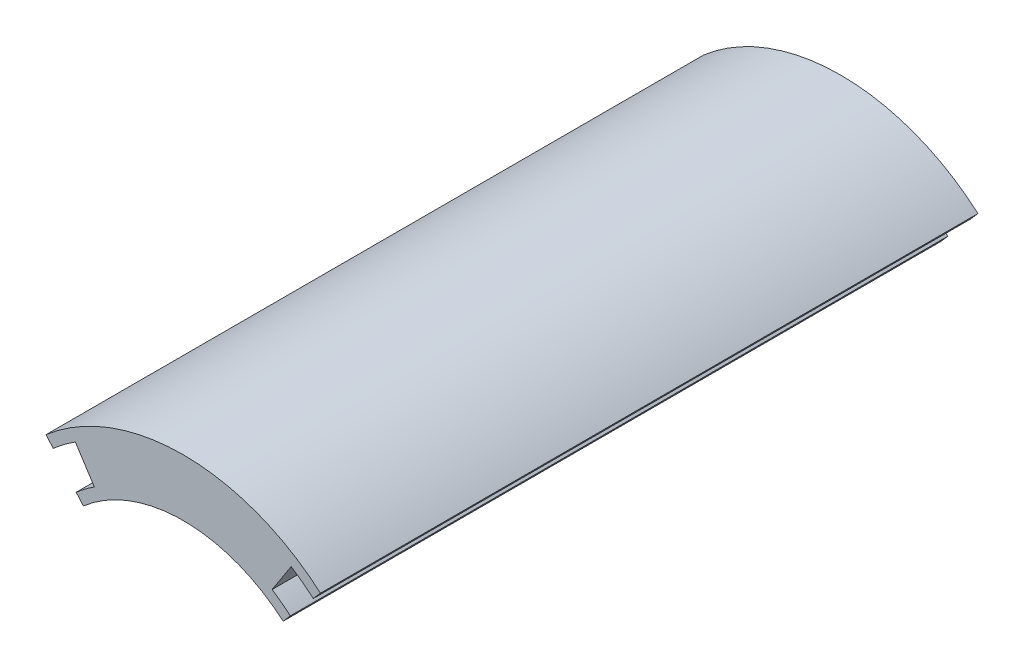
ISO-10303-21;
HEADER;
FILE_DESCRIPTION(('STEP AP214'),'2;1');
FILE_NAME('part.step','',(''),(''),'','','');
FILE_SCHEMA(('AUTOMOTIVE_DESIGN { 1 0 10303 214 1 1 1 1 }'));
ENDSEC;
DATA;
#1=APPLICATION_CONTEXT('core data for automotive mechanical design processes');
#2=APPLICATION_PROTOCOL_DEFINITION('international standard','automotive_design',2000,#1);
#3=PRODUCT_CONTEXT('',#1,'mechanical');
#4=PRODUCT('Part','Part','',(#3));
#5=PRODUCT_RELATED_PRODUCT_CATEGORY('part','',(#4));
#6=PRODUCT_DEFINITION_FORMATION('','',#4);
#7=PRODUCT_DEFINITION_CONTEXT('part definition',#1,'design');
#8=PRODUCT_DEFINITION('design','',#6,#7);
#9=PRODUCT_DEFINITION_SHAPE('','',#8);
#10=(LENGTH_UNIT() NAMED_UNIT(*) SI_UNIT(.MILLI.,.METRE.));
#11=(NAMED_UNIT(*) PLANE_ANGLE_UNIT() SI_UNIT($,.RADIAN.));
#12=(NAMED_UNIT(*) SI_UNIT($,.STERADIAN.) SOLID_ANGLE_UNIT());
#13=UNCERTAINTY_MEASURE_WITH_UNIT(LENGTH_MEASURE(1.E-05),#10,'distance_accuracy_value','');
#14=(GEOMETRIC_REPRESENTATION_CONTEXT(3) GLOBAL_UNCERTAINTY_ASSIGNED_CONTEXT((#13)) GLOBAL_UNIT_ASSIGNED_CONTEXT((#10,
#11,#12)) REPRESENTATION_CONTEXT('',''));
#15=CARTESIAN_POINT('',(0.,0.,0.));
#16=DIRECTION('',(0.,0.,1.));
#17=DIRECTION('',(1.,0.,0.));
#18=AXIS2_PLACEMENT_3D('',#15,#16,#17);
#19=CARTESIAN_POINT('',(0.,0.,60.));
#20=DIRECTION('',(0.,0.,-1.));
#21=DIRECTION('',(-1.,0.,0.));
#22=AXIS2_PLACEMENT_3D('',#19,#20,#21);
#23=CYLINDRICAL_SURFACE('',#22,19.1);
#24=CARTESIAN_POINT('',(0.,0.,0.));
#25=DIRECTION('',(0.,0.,1.));
#26=DIRECTION('',(-1.,0.,0.));
#27=AXIS2_PLACEMENT_3D('',#24,#25,#26);
#28=CIRCLE('',#27,19.1);
#29=CARTESIAN_POINT('',(12.5231619525478,14.4215260881177,0.));
#30=VERTEX_POINT('',#29);
#31=CARTESIAN_POINT('',(-12.5231619525478,14.4215260881177,0.));
#32=VERTEX_POINT('',#31);
#33=EDGE_CURVE('E153',#30,#32,#28,.T.);
#34=ORIENTED_EDGE('',*,*,#33,.T.);
#35=DIRECTION('',(0.,0.,-1.));
#36=VECTOR('',#35,1.);
#37=CARTESIAN_POINT('',(-12.5231619525478,14.4215260881177,60.));
#38=LINE('',#37,#36);
#39=CARTESIAN_POINT('',(-12.5231619525478,14.4215260881177,60.));
#40=VERTEX_POINT('',#39);
#41=EDGE_CURVE('E11',#40,#32,#38,.T.);
#42=ORIENTED_EDGE('',*,*,#41,.F.);
#43=CARTESIAN_POINT('',(0.,0.,60.));
#44=DIRECTION('',(0.,0.,1.));
#45=DIRECTION('',(-1.,0.,0.));
#46=AXIS2_PLACEMENT_3D('',#43,#44,#45);
#47=CIRCLE('',#46,19.1);
#48=CARTESIAN_POINT('',(12.5231619525478,14.4215260881177,60.));
#49=VERTEX_POINT('',#48);
#50=EDGE_CURVE('E175',#49,#40,#47,.T.);
#51=ORIENTED_EDGE('',*,*,#50,.F.);
#52=DIRECTION('',(0.,0.,-1.));
#53=VECTOR('',#52,1.);
#54=CARTESIAN_POINT('',(12.5231619525478,14.4215260881177,60.));
#55=LINE('',#54,#53);
#56=EDGE_CURVE('E149',#49,#30,#55,.T.);
#57=ORIENTED_EDGE('',*,*,#56,.T.);
#58=EDGE_LOOP('',(#34,#42,#51,#57));
#59=FACE_BOUND('',#58,.T.);
#60=ADVANCED_FACE('F33',(#59),#23,.T.);
#61=CARTESIAN_POINT('',(-12.5231619525478,14.4215260881177,60.));
#62=DIRECTION('',(0.755053721890976,0.655662929452768,0.));
#63=DIRECTION('',(-0.655662929452768,0.755053721890976,0.));
#64=AXIS2_PLACEMENT_3D('',#61,#62,#63);
#65=PLANE('',#64);
#66=DIRECTION('',(0.655662929452768,-0.755053721890976,0.));
#67=VECTOR('',#66,1.);
#68=CARTESIAN_POINT('',(-12.5231619525478,14.4215260881177,0.));
#69=LINE('',#68,#67);
#70=CARTESIAN_POINT('',(-11.8674990230951,13.6664723662267,0.));
#71=VERTEX_POINT('',#70);
#72=EDGE_CURVE('E156',#32,#71,#69,.T.);
#73=ORIENTED_EDGE('',*,*,#72,.T.);
#74=DIRECTION('',(0.,0.,-1.));
#75=VECTOR('',#74,1.);
#76=CARTESIAN_POINT('',(-11.8674990230951,13.6664723662267,60.));
#77=LINE('',#76,#75);
#78=CARTESIAN_POINT('',(-11.8674990230951,13.6664723662267,60.));
#79=VERTEX_POINT('',#78);
#80=EDGE_CURVE('E41',#79,#71,#77,.T.);
#81=ORIENTED_EDGE('',*,*,#80,.F.);
#82=DIRECTION('',(0.655662929452768,-0.755053721890976,0.));
#83=VECTOR('',#82,1.);
#84=CARTESIAN_POINT('',(-12.5231619525478,14.4215260881177,60.));
#85=LINE('',#84,#83);
#86=EDGE_CURVE('E104',#40,#79,#85,.T.);
#87=ORIENTED_EDGE('',*,*,#86,.F.);
#88=ORIENTED_EDGE('',*,*,#41,.T.);
#89=EDGE_LOOP('',(#73,#81,#87,#88));
#90=FACE_BOUND('',#89,.T.);
#91=ADVANCED_FACE('F253',(#90),#65,.F.);
#92=CARTESIAN_POINT('',(0.,0.,60.));
#93=DIRECTION('',(0.,0.,-1.));
#94=DIRECTION('',(-1.,0.,0.));
#95=AXIS2_PLACEMENT_3D('',#92,#93,#94);
#96=CYLINDRICAL_SURFACE('',#95,18.1);
#97=CARTESIAN_POINT('',(0.,0.,0.));
#98=DIRECTION('',(0.,0.,-1.));
#99=DIRECTION('',(-1.,0.,0.));
#100=AXIS2_PLACEMENT_3D('',#97,#98,#99);
#101=CIRCLE('',#100,18.1);
#102=CARTESIAN_POINT('',(-9.85,15.185107836298,0.));
#103=VERTEX_POINT('',#102);
#104=EDGE_CURVE('E158',#71,#103,#101,.T.);
#105=ORIENTED_EDGE('',*,*,#104,.T.);
#106=DIRECTION('',(0.,0.,-1.));
#107=VECTOR('',#106,1.);
#108=CARTESIAN_POINT('',(-9.85,15.185107836298,60.));
#109=LINE('',#108,#107);
#110=CARTESIAN_POINT('',(-9.85,15.185107836298,60.));
#111=VERTEX_POINT('',#110);
#112=EDGE_CURVE('E194',#111,#103,#109,.T.);
#113=ORIENTED_EDGE('',*,*,#112,.F.);
#114=CARTESIAN_POINT('',(0.,0.,60.));
#115=DIRECTION('',(0.,0.,-1.));
#116=DIRECTION('',(-1.,0.,0.));
#117=AXIS2_PLACEMENT_3D('',#114,#115,#116);
#118=CIRCLE('',#117,18.1);
#119=EDGE_CURVE('E202',#79,#111,#118,.T.);
#120=ORIENTED_EDGE('',*,*,#119,.F.);
#121=ORIENTED_EDGE('',*,*,#80,.T.);
#122=EDGE_LOOP('',(#105,#113,#120,#121));
#123=FACE_BOUND('',#122,.T.);
#124=ADVANCED_FACE('F200',(#123),#96,.F.);
#125=CARTESIAN_POINT('',(-9.85,15.185107836298,60.));
#126=DIRECTION('',(0.838956234049616,0.544198895027624,0.));
#127=DIRECTION('',(-0.544198895027624,0.838956234049616,0.));
#128=AXIS2_PLACEMENT_3D('',#125,#126,#127);
#129=PLANE('',#128);
#130=DIRECTION('',(0.544198895027624,-0.838956234049615,0.));
#131=VECTOR('',#130,1.);
#132=CARTESIAN_POINT('',(-9.85,15.185107836298,0.));
#133=LINE('',#132,#131);
#134=CARTESIAN_POINT('',(-8.1085635359116,12.5004478873393,0.));
#135=VERTEX_POINT('',#134);
#136=EDGE_CURVE('E160',#103,#135,#133,.T.);
#137=ORIENTED_EDGE('',*,*,#136,.T.);
#138=DIRECTION('',(0.,0.,-1.));
#139=VECTOR('',#138,1.);
#140=CARTESIAN_POINT('',(-8.1085635359116,12.5004478873393,60.));
#141=LINE('',#140,#139);
#142=CARTESIAN_POINT('',(-8.1085635359116,12.5004478873393,60.));
#143=VERTEX_POINT('',#142);
#144=EDGE_CURVE('E191',#143,#135,#141,.T.);
#145=ORIENTED_EDGE('',*,*,#144,.F.);
#146=DIRECTION('',(0.544198895027624,-0.838956234049615,0.));
#147=VECTOR('',#146,1.);
#148=CARTESIAN_POINT('',(-9.85,15.185107836298,60.));
#149=LINE('',#148,#147);
#150=EDGE_CURVE('E220',#111,#143,#149,.T.);
#151=ORIENTED_EDGE('',*,*,#150,.F.);
#152=ORIENTED_EDGE('',*,*,#112,.T.);
#153=EDGE_LOOP('',(#137,#145,#151,#152));
#154=FACE_BOUND('',#153,.T.);
#155=ADVANCED_FACE('F211',(#154),#129,.F.);
#156=CARTESIAN_POINT('',(0.,0.,60.));
#157=DIRECTION('',(0.,0.,-1.));
#158=DIRECTION('',(-1.,0.,0.));
#159=AXIS2_PLACEMENT_3D('',#156,#157,#158);
#160=CYLINDRICAL_SURFACE('',#159,14.9);
#161=CARTESIAN_POINT('',(0.,0.,0.));
#162=DIRECTION('',(0.,0.,1.));
#163=DIRECTION('',(-1.,0.,0.));
#164=AXIS2_PLACEMENT_3D('',#161,#162,#163);
#165=CIRCLE('',#164,14.9);
#166=CARTESIAN_POINT('',(-9.76937764884621,11.2503004561756,0.));
#167=VERTEX_POINT('',#166);
#168=EDGE_CURVE('E162',#135,#167,#165,.T.);
#169=ORIENTED_EDGE('',*,*,#168,.T.);
#170=DIRECTION('',(0.,0.,-1.));
#171=VECTOR('',#170,1.);
#172=CARTESIAN_POINT('',(-9.76937764884621,11.2503004561756,60.));
#173=LINE('',#172,#171);
#174=CARTESIAN_POINT('',(-9.76937764884621,11.2503004561756,60.));
#175=VERTEX_POINT('',#174);
#176=EDGE_CURVE('E188',#175,#167,#173,.T.);
#177=ORIENTED_EDGE('',*,*,#176,.F.);
#178=CARTESIAN_POINT('',(0.,0.,60.));
#179=DIRECTION('',(0.,0.,1.));
#180=DIRECTION('',(-1.,0.,0.));
#181=AXIS2_PLACEMENT_3D('',#178,#179,#180);
#182=CIRCLE('',#181,14.9);
#183=EDGE_CURVE('E217',#143,#175,#182,.T.);
#184=ORIENTED_EDGE('',*,*,#183,.F.);
#185=ORIENTED_EDGE('',*,*,#144,.T.);
#186=EDGE_LOOP('',(#169,#177,#184,#185));
#187=FACE_BOUND('',#186,.T.);
#188=ADVANCED_FACE('F215',(#187),#160,.T.);
#189=CARTESIAN_POINT('',(-9.76937764884621,11.2503004561756,60.));
#190=DIRECTION('',(0.755053721890979,0.655662929452764,0.));
#191=DIRECTION('',(-0.655662929452764,0.755053721890979,0.));
#192=AXIS2_PLACEMENT_3D('',#189,#190,#191);
#193=PLANE('',#192);
#194=DIRECTION('',(0.655662929452764,-0.755053721890979,0.));
#195=VECTOR('',#194,1.);
#196=CARTESIAN_POINT('',(-9.76937764884621,11.2503004561756,0.));
#197=LINE('',#196,#195);
#198=CARTESIAN_POINT('',(-9.11371471939344,10.4952467342846,0.));
#199=VERTEX_POINT('',#198);
#200=EDGE_CURVE('E164',#167,#199,#197,.T.);
#201=ORIENTED_EDGE('',*,*,#200,.T.);
#202=DIRECTION('',(0.,0.,-1.));
#203=VECTOR('',#202,1.);
#204=CARTESIAN_POINT('',(-9.11371471939344,10.4952467342846,60.));
#205=LINE('',#204,#203);
#206=CARTESIAN_POINT('',(-9.11371471939344,10.4952467342846,60.));
#207=VERTEX_POINT('',#206);
#208=EDGE_CURVE('E185',#207,#199,#205,.T.);
#209=ORIENTED_EDGE('',*,*,#208,.F.);
#210=DIRECTION('',(0.655662929452764,-0.755053721890979,0.));
#211=VECTOR('',#210,1.);
#212=CARTESIAN_POINT('',(-9.76937764884621,11.2503004561756,60.));
#213=LINE('',#212,#211);
#214=EDGE_CURVE('E219',#175,#207,#213,.T.);
#215=ORIENTED_EDGE('',*,*,#214,.F.);
#216=ORIENTED_EDGE('',*,*,#176,.T.);
#217=EDGE_LOOP('',(#201,#209,#215,#216));
#218=FACE_BOUND('',#217,.T.);
#219=ADVANCED_FACE('F266',(#218),#193,.F.);
#220=CARTESIAN_POINT('',(0.,0.,60.));
#221=DIRECTION('',(0.,0.,-1.));
#222=DIRECTION('',(-1.,0.,0.));
#223=AXIS2_PLACEMENT_3D('',#220,#221,#222);
#224=CYLINDRICAL_SURFACE('',#223,13.9);
#225=CARTESIAN_POINT('',(0.,0.,0.));
#226=DIRECTION('',(0.,0.,-1.));
#227=DIRECTION('',(-1.,0.,0.));
#228=AXIS2_PLACEMENT_3D('',#225,#226,#227);
#229=CIRCLE('',#228,13.9);
#230=CARTESIAN_POINT('',(9.11371471939344,10.4952467342846,0.));
#231=VERTEX_POINT('',#230);
#232=EDGE_CURVE('E166',#199,#231,#229,.T.);
#233=ORIENTED_EDGE('',*,*,#232,.T.);
#234=DIRECTION('',(0.,0.,-1.));
#235=VECTOR('',#234,1.);
#236=CARTESIAN_POINT('',(9.11371471939344,10.4952467342846,60.));
#237=LINE('',#236,#235);
#238=CARTESIAN_POINT('',(9.11371471939344,10.4952467342846,60.));
#239=VERTEX_POINT('',#238);
#240=EDGE_CURVE('E182',#239,#231,#237,.T.);
#241=ORIENTED_EDGE('',*,*,#240,.F.);
#242=CARTESIAN_POINT('',(0.,0.,60.));
#243=DIRECTION('',(0.,0.,-1.));
#244=DIRECTION('',(-1.,0.,0.));
#245=AXIS2_PLACEMENT_3D('',#242,#243,#244);
#246=CIRCLE('',#245,13.9);
#247=EDGE_CURVE('E222',#207,#239,#246,.T.);
#248=ORIENTED_EDGE('',*,*,#247,.F.);
#249=ORIENTED_EDGE('',*,*,#208,.T.);
#250=EDGE_LOOP('',(#233,#241,#248,#249));
#251=FACE_BOUND('',#250,.T.);
#252=ADVANCED_FACE('F269',(#251),#224,.F.);
#253=CARTESIAN_POINT('',(9.76937764884621,11.2503004561756,60.));
#254=DIRECTION('',(-0.755053721890979,0.655662929452764,0.));
#255=DIRECTION('',(-0.655662929452764,-0.755053721890979,0.));
#256=AXIS2_PLACEMENT_3D('',#253,#254,#255);
#257=PLANE('',#256);
#258=DIRECTION('',(0.655662929452764,0.755053721890979,0.));
#259=VECTOR('',#258,1.);
#260=CARTESIAN_POINT('',(9.76937764884621,11.2503004561756,0.));
#261=LINE('',#260,#259);
#262=CARTESIAN_POINT('',(9.76937764884621,11.2503004561756,0.));
#263=VERTEX_POINT('',#262);
#264=EDGE_CURVE('E168',#231,#263,#261,.T.);
#265=ORIENTED_EDGE('',*,*,#264,.T.);
#266=DIRECTION('',(0.,0.,-1.));
#267=VECTOR('',#266,1.);
#268=CARTESIAN_POINT('',(9.76937764884621,11.2503004561756,60.));
#269=LINE('',#268,#267);
#270=CARTESIAN_POINT('',(9.76937764884621,11.2503004561756,60.));
#271=VERTEX_POINT('',#270);
#272=EDGE_CURVE('E179',#271,#263,#269,.T.);
#273=ORIENTED_EDGE('',*,*,#272,.F.);
#274=DIRECTION('',(0.655662929452764,0.755053721890979,0.));
#275=VECTOR('',#274,1.);
#276=CARTESIAN_POINT('',(9.76937764884621,11.2503004561756,60.));
#277=LINE('',#276,#275);
#278=EDGE_CURVE('E228',#239,#271,#277,.T.);
#279=ORIENTED_EDGE('',*,*,#278,.F.);
#280=ORIENTED_EDGE('',*,*,#240,.T.);
#281=EDGE_LOOP('',(#265,#273,#279,#280));
#282=FACE_BOUND('',#281,.T.);
#283=ADVANCED_FACE('F234',(#282),#257,.F.);
#284=CARTESIAN_POINT('',(0.,0.,60.));
#285=DIRECTION('',(0.,0.,-1.));
#286=DIRECTION('',(-1.,0.,0.));
#287=AXIS2_PLACEMENT_3D('',#284,#285,#286);
#288=CYLINDRICAL_SURFACE('',#287,14.9);
#289=CARTESIAN_POINT('',(0.,0.,0.));
#290=DIRECTION('',(0.,0.,1.));
#291=DIRECTION('',(-1.,0.,0.));
#292=AXIS2_PLACEMENT_3D('',#289,#290,#291);
#293=CIRCLE('',#292,14.9);
#294=CARTESIAN_POINT('',(8.1085635359116,12.5004478873393,0.));
#295=VERTEX_POINT('',#294);
#296=EDGE_CURVE('E170',#263,#295,#293,.T.);
#297=ORIENTED_EDGE('',*,*,#296,.T.);
#298=DIRECTION('',(0.,0.,-1.));
#299=VECTOR('',#298,1.);
#300=CARTESIAN_POINT('',(8.1085635359116,12.5004478873393,60.));
#301=LINE('',#300,#299);
#302=CARTESIAN_POINT('',(8.1085635359116,12.5004478873393,60.));
#303=VERTEX_POINT('',#302);
#304=EDGE_CURVE('E144',#303,#295,#301,.T.);
#305=ORIENTED_EDGE('',*,*,#304,.F.);
#306=CARTESIAN_POINT('',(0.,0.,60.));
#307=DIRECTION('',(0.,0.,1.));
#308=DIRECTION('',(-1.,0.,0.));
#309=AXIS2_PLACEMENT_3D('',#306,#307,#308);
#310=CIRCLE('',#309,14.9);
#311=EDGE_CURVE('E135',#271,#303,#310,.T.);
#312=ORIENTED_EDGE('',*,*,#311,.F.);
#313=ORIENTED_EDGE('',*,*,#272,.T.);
#314=EDGE_LOOP('',(#297,#305,#312,#313));
#315=FACE_BOUND('',#314,.T.);
#316=ADVANCED_FACE('F238',(#315),#288,.T.);
#317=CARTESIAN_POINT('',(9.85,15.185107836298,60.));
#318=DIRECTION('',(-0.838956234049616,0.544198895027624,0.));
#319=DIRECTION('',(-0.544198895027624,-0.838956234049616,0.));
#320=AXIS2_PLACEMENT_3D('',#317,#318,#319);
#321=PLANE('',#320);
#322=DIRECTION('',(0.544198895027624,0.838956234049615,0.));
#323=VECTOR('',#322,1.);
#324=CARTESIAN_POINT('',(9.85,15.185107836298,0.));
#325=LINE('',#324,#323);
#326=CARTESIAN_POINT('',(9.85,15.185107836298,0.));
#327=VERTEX_POINT('',#326);
#328=EDGE_CURVE('E143',#295,#327,#325,.T.);
#329=ORIENTED_EDGE('',*,*,#328,.T.);
#330=DIRECTION('',(0.,0.,-1.));
#331=VECTOR('',#330,1.);
#332=CARTESIAN_POINT('',(9.85,15.185107836298,60.));
#333=LINE('',#332,#331);
#334=CARTESIAN_POINT('',(9.85,15.185107836298,60.));
#335=VERTEX_POINT('',#334);
#336=EDGE_CURVE('E140',#335,#327,#333,.T.);
#337=ORIENTED_EDGE('',*,*,#336,.F.);
#338=DIRECTION('',(0.544198895027624,0.838956234049615,0.));
#339=VECTOR('',#338,1.);
#340=CARTESIAN_POINT('',(9.85,15.185107836298,60.));
#341=LINE('',#340,#339);
#342=EDGE_CURVE('E129',#303,#335,#341,.T.);
#343=ORIENTED_EDGE('',*,*,#342,.F.);
#344=ORIENTED_EDGE('',*,*,#304,.T.);
#345=EDGE_LOOP('',(#329,#337,#343,#344));
#346=FACE_BOUND('',#345,.T.);
#347=ADVANCED_FACE('F141',(#346),#321,.F.);
#348=CARTESIAN_POINT('',(0.,0.,60.));
#349=DIRECTION('',(0.,0.,-1.));
#350=DIRECTION('',(-1.,0.,0.));
#351=AXIS2_PLACEMENT_3D('',#348,#349,#350);
#352=CYLINDRICAL_SURFACE('',#351,18.1);
#353=CARTESIAN_POINT('',(0.,0.,0.));
#354=DIRECTION('',(0.,0.,-1.));
#355=DIRECTION('',(-1.,0.,0.));
#356=AXIS2_PLACEMENT_3D('',#353,#354,#355);
#357=CIRCLE('',#356,18.1);
#358=CARTESIAN_POINT('',(11.8674990230951,13.6664723662267,0.));
#359=VERTEX_POINT('',#358);
#360=EDGE_CURVE('E90',#327,#359,#357,.T.);
#361=ORIENTED_EDGE('',*,*,#360,.T.);
#362=DIRECTION('',(0.,0.,-1.));
#363=VECTOR('',#362,1.);
#364=CARTESIAN_POINT('',(11.8674990230951,13.6664723662267,60.));
#365=LINE('',#364,#363);
#366=CARTESIAN_POINT('',(11.8674990230951,13.6664723662267,60.));
#367=VERTEX_POINT('',#366);
#368=EDGE_CURVE('E145',#367,#359,#365,.T.);
#369=ORIENTED_EDGE('',*,*,#368,.F.);
#370=CARTESIAN_POINT('',(0.,0.,60.));
#371=DIRECTION('',(0.,0.,-1.));
#372=DIRECTION('',(-1.,0.,0.));
#373=AXIS2_PLACEMENT_3D('',#370,#371,#372);
#374=CIRCLE('',#373,18.1);
#375=EDGE_CURVE('E133',#335,#367,#374,.T.);
#376=ORIENTED_EDGE('',*,*,#375,.F.);
#377=ORIENTED_EDGE('',*,*,#336,.T.);
#378=EDGE_LOOP('',(#361,#369,#376,#377));
#379=FACE_BOUND('',#378,.T.);
#380=ADVANCED_FACE('F147',(#379),#352,.F.);
#381=CARTESIAN_POINT('',(12.5231619525478,14.4215260881177,60.));
#382=DIRECTION('',(-0.755053721890976,0.655662929452768,0.));
#383=DIRECTION('',(-0.655662929452768,-0.755053721890976,0.));
#384=AXIS2_PLACEMENT_3D('',#381,#382,#383);
#385=PLANE('',#384);
#386=DIRECTION('',(0.655662929452768,0.755053721890976,0.));
#387=VECTOR('',#386,1.);
#388=CARTESIAN_POINT('',(12.5231619525478,14.4215260881177,0.));
#389=LINE('',#388,#387);
#390=EDGE_CURVE('E96',#359,#30,#389,.T.);
#391=ORIENTED_EDGE('',*,*,#390,.T.);
#392=ORIENTED_EDGE('',*,*,#56,.F.);
#393=DIRECTION('',(0.655662929452768,0.755053721890976,0.));
#394=VECTOR('',#393,1.);
#395=CARTESIAN_POINT('',(12.5231619525478,14.4215260881177,60.));
#396=LINE('',#395,#394);
#397=EDGE_CURVE('E49',#367,#49,#396,.T.);
#398=ORIENTED_EDGE('',*,*,#397,.F.);
#399=ORIENTED_EDGE('',*,*,#368,.T.);
#400=EDGE_LOOP('',(#391,#392,#398,#399));
#401=FACE_BOUND('',#400,.T.);
#402=ADVANCED_FACE('F242',(#401),#385,.F.);
#403=CARTESIAN_POINT('',(0.,0.,60.));
#404=DIRECTION('',(0.,0.,-1.));
#405=DIRECTION('',(-1.,0.,0.));
#406=AXIS2_PLACEMENT_3D('',#403,#404,#405);
#407=PLANE('',#406);
#408=ORIENTED_EDGE('',*,*,#50,.T.);
#409=ORIENTED_EDGE('',*,*,#86,.T.);
#410=ORIENTED_EDGE('',*,*,#119,.T.);
#411=ORIENTED_EDGE('',*,*,#150,.T.);
#412=ORIENTED_EDGE('',*,*,#183,.T.);
#413=ORIENTED_EDGE('',*,*,#214,.T.);
#414=ORIENTED_EDGE('',*,*,#247,.T.);
#415=ORIENTED_EDGE('',*,*,#278,.T.);
#416=ORIENTED_EDGE('',*,*,#311,.T.);
#417=ORIENTED_EDGE('',*,*,#342,.T.);
#418=ORIENTED_EDGE('',*,*,#375,.T.);
#419=ORIENTED_EDGE('',*,*,#397,.T.);
#420=EDGE_LOOP('',(#408,#409,#410,#411,#412,#413,#414,#415,#416,#417,#418,#419));
#421=FACE_BOUND('',#420,.T.);
#422=ADVANCED_FACE('F131',(#421),#407,.F.);
#423=CARTESIAN_POINT('',(0.,0.,0.));
#424=DIRECTION('',(0.,0.,-1.));
#425=DIRECTION('',(-1.,0.,0.));
#426=AXIS2_PLACEMENT_3D('',#423,#424,#425);
#427=PLANE('',#426);
#428=ORIENTED_EDGE('',*,*,#33,.F.);
#429=ORIENTED_EDGE('',*,*,#390,.F.);
#430=ORIENTED_EDGE('',*,*,#360,.F.);
#431=ORIENTED_EDGE('',*,*,#328,.F.);
#432=ORIENTED_EDGE('',*,*,#296,.F.);
#433=ORIENTED_EDGE('',*,*,#264,.F.);
#434=ORIENTED_EDGE('',*,*,#232,.F.);
#435=ORIENTED_EDGE('',*,*,#200,.F.);
#436=ORIENTED_EDGE('',*,*,#168,.F.);
#437=ORIENTED_EDGE('',*,*,#136,.F.);
#438=ORIENTED_EDGE('',*,*,#104,.F.);
#439=ORIENTED_EDGE('',*,*,#72,.F.);
#440=EDGE_LOOP('',(#428,#429,#430,#431,#432,#433,#434,#435,#436,#437,#438,#439));
#441=FACE_BOUND('',#440,.T.);
#442=ADVANCED_FACE('F206',(#441),#427,.T.);
#443=CLOSED_SHELL('',(#60,#91,#124,#155,#188,#219,#252,#283,#316,#347,#380,#402,#422,#442));
#444=MANIFOLD_SOLID_BREP('B2',#443);
#445=ADVANCED_BREP_SHAPE_REPRESENTATION('',(#18,#444),#14);
#446=SHAPE_DEFINITION_REPRESENTATION(#9,#445);
ENDSEC;
END-ISO-10303-21;
